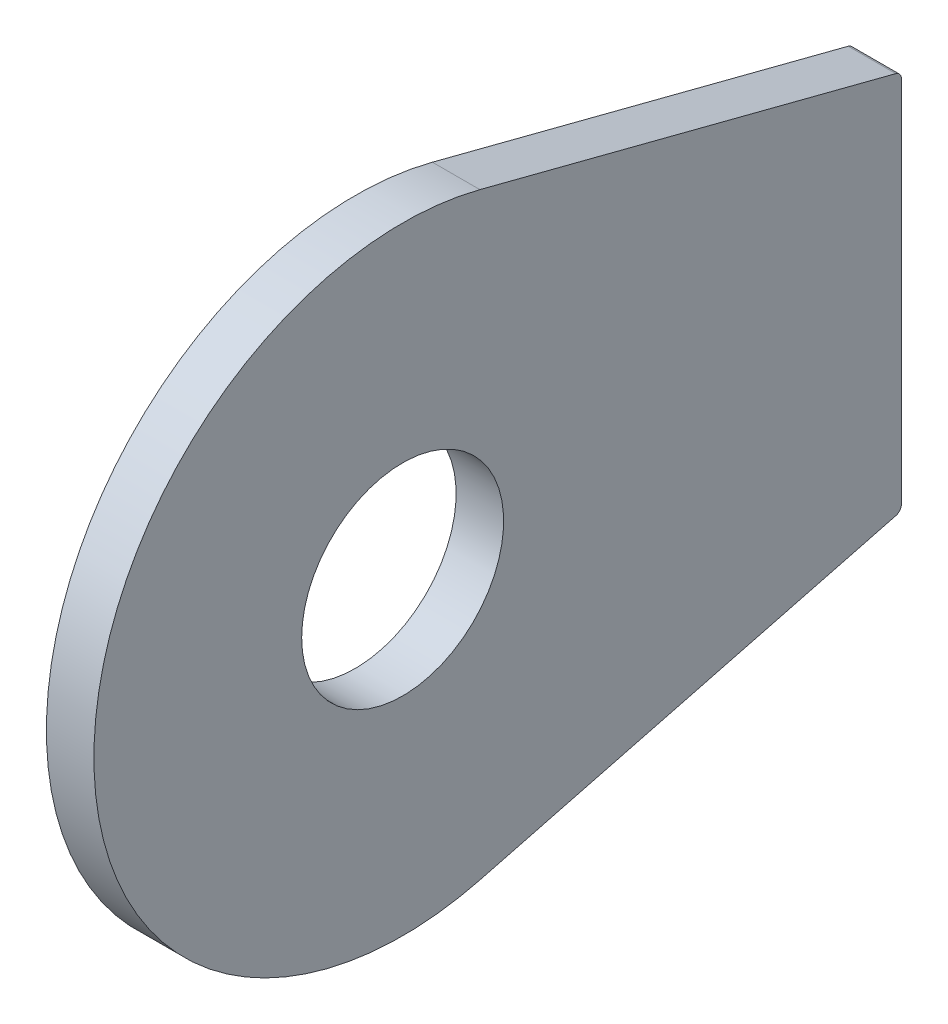
ISO-10303-21;
HEADER;
FILE_DESCRIPTION(('STEP AP214'),'2;1');
FILE_NAME('part.step','',(''),(''),'','','');
FILE_SCHEMA(('AUTOMOTIVE_DESIGN { 1 0 10303 214 1 1 1 1 }'));
ENDSEC;
DATA;
#1=APPLICATION_CONTEXT('core data for automotive mechanical design processes');
#2=APPLICATION_PROTOCOL_DEFINITION('international standard','automotive_design',2000,#1);
#3=PRODUCT_CONTEXT('',#1,'mechanical');
#4=PRODUCT('Part','Part','',(#3));
#5=PRODUCT_RELATED_PRODUCT_CATEGORY('part','',(#4));
#6=PRODUCT_DEFINITION_FORMATION('','',#4);
#7=PRODUCT_DEFINITION_CONTEXT('part definition',#1,'design');
#8=PRODUCT_DEFINITION('design','',#6,#7);
#9=PRODUCT_DEFINITION_SHAPE('','',#8);
#10=(LENGTH_UNIT() NAMED_UNIT(*) SI_UNIT(.MILLI.,.METRE.));
#11=(NAMED_UNIT(*) PLANE_ANGLE_UNIT() SI_UNIT($,.RADIAN.));
#12=(NAMED_UNIT(*) SI_UNIT($,.STERADIAN.) SOLID_ANGLE_UNIT());
#13=UNCERTAINTY_MEASURE_WITH_UNIT(LENGTH_MEASURE(1.E-05),#10,'distance_accuracy_value','');
#14=(GEOMETRIC_REPRESENTATION_CONTEXT(3) GLOBAL_UNCERTAINTY_ASSIGNED_CONTEXT((#13)) GLOBAL_UNIT_ASSIGNED_CONTEXT((#10,
#11,#12)) REPRESENTATION_CONTEXT('',''));
#15=CARTESIAN_POINT('',(0.,0.,0.));
#16=DIRECTION('',(0.,0.,1.));
#17=DIRECTION('',(1.,0.,0.));
#18=AXIS2_PLACEMENT_3D('',#15,#16,#17);
#19=CARTESIAN_POINT('',(1.5875,19.981037813843,-5.1637713090122));
#20=DIRECTION('',(0.,-0.968190808665922,0.250213025270125));
#21=DIRECTION('',(0.,-0.250213025270125,-0.968190808665922));
#22=AXIS2_PLACEMENT_3D('',#19,#20,#21);
#23=PLANE('',#22);
#24=DIRECTION('',(0.,0.250213025270125,0.968190808665922));
#25=VECTOR('',#24,1.);
#26=CARTESIAN_POINT('',(1.5875,19.981037813843,-5.1637713090122));
#27=LINE('',#26,#25);
#28=CARTESIAN_POINT('',(1.5875,12.7984352304449,-32.9566082168372));
#29=VERTEX_POINT('',#28);
#30=CARTESIAN_POINT('',(1.5875,19.981037813843,-5.16377130901221));
#31=VERTEX_POINT('',#30);
#32=EDGE_CURVE('E98',#29,#31,#27,.T.);
#33=ORIENTED_EDGE('',*,*,#32,.F.);
#34=DIRECTION('',(-1.,0.,0.));
#35=VECTOR('',#34,1.);
#36=CARTESIAN_POINT('',(1.5875,12.7984352304449,-32.9566082168372));
#37=LINE('',#36,#35);
#38=CARTESIAN_POINT('',(-1.5875,12.7984352304449,-32.9566082168372));
#39=VERTEX_POINT('',#38);
#40=EDGE_CURVE('E136',#29,#39,#37,.T.);
#41=ORIENTED_EDGE('',*,*,#40,.T.);
#42=DIRECTION('',(0.,0.250213025270125,0.968190808665922));
#43=VECTOR('',#42,1.);
#44=CARTESIAN_POINT('',(-1.5875,19.981037813843,-5.1637713090122));
#45=LINE('',#44,#43);
#46=CARTESIAN_POINT('',(-1.5875,19.981037813843,-5.16377130901221));
#47=VERTEX_POINT('',#46);
#48=EDGE_CURVE('E120',#39,#47,#45,.T.);
#49=ORIENTED_EDGE('',*,*,#48,.T.);
#50=DIRECTION('',(-1.,0.,0.));
#51=VECTOR('',#50,1.);
#52=CARTESIAN_POINT('',(1.5875,19.981037813843,-5.16377130901221));
#53=LINE('',#52,#51);
#54=EDGE_CURVE('E115',#31,#47,#53,.T.);
#55=ORIENTED_EDGE('',*,*,#54,.F.);
#56=EDGE_LOOP('',(#33,#41,#49,#55));
#57=FACE_BOUND('',#56,.T.);
#58=ADVANCED_FACE('F45',(#57),#23,.F.);
#59=CARTESIAN_POINT('',(1.5875,0.,0.));
#60=DIRECTION('',(-1.,0.,0.));
#61=DIRECTION('',(0.,0.,1.));
#62=AXIS2_PLACEMENT_3D('',#59,#60,#61);
#63=CYLINDRICAL_SURFACE('',#62,20.6375);
#64=CARTESIAN_POINT('',(-1.5875,0.,0.));
#65=DIRECTION('',(1.,0.,0.));
#66=DIRECTION('',(0.,0.,-1.));
#67=AXIS2_PLACEMENT_3D('',#64,#65,#66);
#68=CIRCLE('',#67,20.6375);
#69=CARTESIAN_POINT('',(-1.5875,-19.981037813843,-5.16377130901221));
#70=VERTEX_POINT('',#69);
#71=EDGE_CURVE('E140',#47,#70,#68,.T.);
#72=ORIENTED_EDGE('',*,*,#71,.T.);
#73=DIRECTION('',(-1.,0.,0.));
#74=VECTOR('',#73,1.);
#75=CARTESIAN_POINT('',(1.5875,-19.981037813843,-5.16377130901221));
#76=LINE('',#75,#74);
#77=CARTESIAN_POINT('',(1.5875,-19.981037813843,-5.16377130901221));
#78=VERTEX_POINT('',#77);
#79=EDGE_CURVE('E117',#78,#70,#76,.T.);
#80=ORIENTED_EDGE('',*,*,#79,.F.);
#81=CARTESIAN_POINT('',(1.5875,0.,0.));
#82=DIRECTION('',(1.,0.,0.));
#83=DIRECTION('',(0.,0.,-1.));
#84=AXIS2_PLACEMENT_3D('',#81,#82,#83);
#85=CIRCLE('',#84,20.6375);
#86=EDGE_CURVE('E102',#31,#78,#85,.T.);
#87=ORIENTED_EDGE('',*,*,#86,.F.);
#88=ORIENTED_EDGE('',*,*,#54,.T.);
#89=EDGE_LOOP('',(#72,#80,#87,#88));
#90=FACE_BOUND('',#89,.T.);
#91=ADVANCED_FACE('F114',(#90),#63,.T.);
#92=CARTESIAN_POINT('',(1.5875,-19.981037813843,-5.1637713090122));
#93=DIRECTION('',(0.,-0.968190808665922,-0.250213025270125));
#94=DIRECTION('',(0.,0.250213025270125,-0.968190808665922));
#95=AXIS2_PLACEMENT_3D('',#92,#93,#94);
#96=PLANE('',#95);
#97=DIRECTION('',(0.,-0.250213025270125,0.968190808665922));
#98=VECTOR('',#97,1.);
#99=CARTESIAN_POINT('',(-1.5875,-19.981037813843,-5.1637713090122));
#100=LINE('',#99,#98);
#101=CARTESIAN_POINT('',(-1.5875,-12.7984352304449,-32.9566082168372));
#102=VERTEX_POINT('',#101);
#103=EDGE_CURVE('E143',#102,#70,#100,.T.);
#104=ORIENTED_EDGE('',*,*,#103,.F.);
#105=DIRECTION('',(-1.,0.,0.));
#106=VECTOR('',#105,1.);
#107=CARTESIAN_POINT('',(1.5875,-12.7984352304449,-32.9566082168372));
#108=LINE('',#107,#106);
#109=CARTESIAN_POINT('',(1.5875,-12.7984352304449,-32.9566082168372));
#110=VERTEX_POINT('',#109);
#111=EDGE_CURVE('E132',#102,#110,#108,.F.);
#112=ORIENTED_EDGE('',*,*,#111,.T.);
#113=DIRECTION('',(0.,-0.250213025270125,0.968190808665922));
#114=VECTOR('',#113,1.);
#115=CARTESIAN_POINT('',(1.5875,-19.981037813843,-5.1637713090122));
#116=LINE('',#115,#114);
#117=EDGE_CURVE('E118',#110,#78,#116,.T.);
#118=ORIENTED_EDGE('',*,*,#117,.T.);
#119=ORIENTED_EDGE('',*,*,#79,.T.);
#120=EDGE_LOOP('',(#104,#112,#118,#119));
#121=FACE_BOUND('',#120,.T.);
#122=ADVANCED_FACE('F170',(#121),#96,.T.);
#123=CARTESIAN_POINT('',(1.5875,0.,-33.3375));
#124=DIRECTION('',(0.,0.,1.));
#125=DIRECTION('',(1.,0.,0.));
#126=AXIS2_PLACEMENT_3D('',#123,#124,#125);
#127=PLANE('',#126);
#128=DIRECTION('',(0.,1.,0.));
#129=VECTOR('',#128,1.);
#130=CARTESIAN_POINT('',(-1.5875,0.,-33.3375));
#131=LINE('',#130,#129);
#132=CARTESIAN_POINT('',(-1.5875,-12.3065942996426,-33.3375));
#133=VERTEX_POINT('',#132);
#134=CARTESIAN_POINT('',(-1.5875,12.3065942996426,-33.3375));
#135=VERTEX_POINT('',#134);
#136=EDGE_CURVE('E109',#133,#135,#131,.T.);
#137=ORIENTED_EDGE('',*,*,#136,.T.);
#138=DIRECTION('',(-1.,0.,0.));
#139=VECTOR('',#138,1.);
#140=CARTESIAN_POINT('',(1.5875,12.3065942996426,-33.3375));
#141=LINE('',#140,#139);
#142=CARTESIAN_POINT('',(1.5875,12.3065942996426,-33.3375));
#143=VERTEX_POINT('',#142);
#144=EDGE_CURVE('E53',#135,#143,#141,.F.);
#145=ORIENTED_EDGE('',*,*,#144,.T.);
#146=DIRECTION('',(0.,1.,0.));
#147=VECTOR('',#146,1.);
#148=CARTESIAN_POINT('',(1.5875,0.,-33.3375));
#149=LINE('',#148,#147);
#150=CARTESIAN_POINT('',(1.5875,-12.3065942996426,-33.3375));
#151=VERTEX_POINT('',#150);
#152=EDGE_CURVE('E127',#151,#143,#149,.T.);
#153=ORIENTED_EDGE('',*,*,#152,.F.);
#154=DIRECTION('',(-1.,0.,0.));
#155=VECTOR('',#154,1.);
#156=CARTESIAN_POINT('',(-1.5875,-12.3065942996426,-33.3375));
#157=LINE('',#156,#155);
#158=EDGE_CURVE('E122',#151,#133,#157,.T.);
#159=ORIENTED_EDGE('',*,*,#158,.T.);
#160=EDGE_LOOP('',(#137,#145,#153,#159));
#161=FACE_BOUND('',#160,.T.);
#162=ADVANCED_FACE('F151',(#161),#127,.F.);
#163=CARTESIAN_POINT('',(1.5875,0.,0.));
#164=DIRECTION('',(1.,0.,0.));
#165=DIRECTION('',(0.,0.,-1.));
#166=AXIS2_PLACEMENT_3D('',#163,#164,#165);
#167=PLANE('',#166);
#168=CARTESIAN_POINT('',(1.5875,0.,0.));
#169=DIRECTION('',(-1.,0.,0.));
#170=DIRECTION('',(0.,0.,1.));
#171=AXIS2_PLACEMENT_3D('',#168,#169,#170);
#172=CIRCLE('',#171,6.75);
#173=CARTESIAN_POINT('',(1.5875,0.,6.75));
#174=VERTEX_POINT('',#173);
#175=EDGE_CURVE('E141',#174,#174,#172,.T.);
#176=ORIENTED_EDGE('',*,*,#175,.T.);
#177=EDGE_LOOP('',(#176));
#178=FACE_BOUND('',#177,.T.);
#179=ORIENTED_EDGE('',*,*,#152,.T.);
#180=CARTESIAN_POINT('',(1.5875,12.3065942996426,-32.8295));
#181=DIRECTION('',(1.,0.,0.));
#182=DIRECTION('',(0.,0.,-1.));
#183=AXIS2_PLACEMENT_3D('',#180,#181,#182);
#184=CIRCLE('',#183,0.508);
#185=EDGE_CURVE('E11',#143,#29,#184,.T.);
#186=ORIENTED_EDGE('',*,*,#185,.T.);
#187=ORIENTED_EDGE('',*,*,#32,.T.);
#188=ORIENTED_EDGE('',*,*,#86,.T.);
#189=ORIENTED_EDGE('',*,*,#117,.F.);
#190=CARTESIAN_POINT('',(1.5875,-12.3065942996426,-32.8295));
#191=DIRECTION('',(1.,0.,0.));
#192=DIRECTION('',(0.,0.,-1.));
#193=AXIS2_PLACEMENT_3D('',#190,#191,#192);
#194=CIRCLE('',#193,0.508);
#195=EDGE_CURVE('E134',#110,#151,#194,.T.);
#196=ORIENTED_EDGE('',*,*,#195,.T.);
#197=EDGE_LOOP('',(#179,#186,#187,#188,#189,#196));
#198=FACE_BOUND('',#197,.T.);
#199=ADVANCED_FACE('F100',(#178,#198),#167,.T.);
#200=CARTESIAN_POINT('',(-1.5875,0.,0.));
#201=DIRECTION('',(1.,0.,0.));
#202=DIRECTION('',(0.,0.,-1.));
#203=AXIS2_PLACEMENT_3D('',#200,#201,#202);
#204=PLANE('',#203);
#205=CARTESIAN_POINT('',(-1.5875,0.,0.));
#206=DIRECTION('',(-1.,0.,0.));
#207=DIRECTION('',(0.,0.,1.));
#208=AXIS2_PLACEMENT_3D('',#205,#206,#207);
#209=CIRCLE('',#208,6.75);
#210=CARTESIAN_POINT('',(-1.5875,0.,6.75));
#211=VERTEX_POINT('',#210);
#212=EDGE_CURVE('E146',#211,#211,#209,.T.);
#213=ORIENTED_EDGE('',*,*,#212,.F.);
#214=EDGE_LOOP('',(#213));
#215=FACE_BOUND('',#214,.T.);
#216=ORIENTED_EDGE('',*,*,#48,.F.);
#217=CARTESIAN_POINT('',(-1.5875,12.3065942996426,-32.8295));
#218=DIRECTION('',(1.,0.,0.));
#219=DIRECTION('',(0.,0.,-1.));
#220=AXIS2_PLACEMENT_3D('',#217,#218,#219);
#221=CIRCLE('',#220,0.508);
#222=EDGE_CURVE('E67',#39,#135,#221,.F.);
#223=ORIENTED_EDGE('',*,*,#222,.T.);
#224=ORIENTED_EDGE('',*,*,#136,.F.);
#225=CARTESIAN_POINT('',(-1.5875,-12.3065942996426,-32.8295));
#226=DIRECTION('',(1.,0.,0.));
#227=DIRECTION('',(0.,0.,-1.));
#228=AXIS2_PLACEMENT_3D('',#225,#226,#227);
#229=CIRCLE('',#228,0.508);
#230=EDGE_CURVE('E125',#133,#102,#229,.F.);
#231=ORIENTED_EDGE('',*,*,#230,.T.);
#232=ORIENTED_EDGE('',*,*,#103,.T.);
#233=ORIENTED_EDGE('',*,*,#71,.F.);
#234=EDGE_LOOP('',(#216,#223,#224,#231,#232,#233));
#235=FACE_BOUND('',#234,.T.);
#236=ADVANCED_FACE('F139',(#215,#235),#204,.F.);
#237=CARTESIAN_POINT('',(1.5875,-12.3065942996426,-32.8295));
#238=DIRECTION('',(1.,0.,0.));
#239=DIRECTION('',(0.,0.,-1.));
#240=AXIS2_PLACEMENT_3D('',#237,#238,#239);
#241=CYLINDRICAL_SURFACE('',#240,0.508);
#242=ORIENTED_EDGE('',*,*,#195,.F.);
#243=ORIENTED_EDGE('',*,*,#111,.F.);
#244=ORIENTED_EDGE('',*,*,#230,.F.);
#245=ORIENTED_EDGE('',*,*,#158,.F.);
#246=EDGE_LOOP('',(#242,#243,#244,#245));
#247=FACE_BOUND('',#246,.T.);
#248=ADVANCED_FACE('F155',(#247),#241,.T.);
#249=CARTESIAN_POINT('',(1.5875,12.3065942996426,-32.8295));
#250=DIRECTION('',(-1.,0.,0.));
#251=DIRECTION('',(0.,0.,1.));
#252=AXIS2_PLACEMENT_3D('',#249,#250,#251);
#253=CYLINDRICAL_SURFACE('',#252,0.508);
#254=ORIENTED_EDGE('',*,*,#185,.F.);
#255=ORIENTED_EDGE('',*,*,#144,.F.);
#256=ORIENTED_EDGE('',*,*,#222,.F.);
#257=ORIENTED_EDGE('',*,*,#40,.F.);
#258=EDGE_LOOP('',(#254,#255,#256,#257));
#259=FACE_BOUND('',#258,.T.);
#260=ADVANCED_FACE('F47',(#259),#253,.T.);
#261=CARTESIAN_POINT('',(-1.5875,0.,0.));
#262=DIRECTION('',(-1.,0.,0.));
#263=DIRECTION('',(0.,0.,1.));
#264=AXIS2_PLACEMENT_3D('',#261,#262,#263);
#265=CYLINDRICAL_SURFACE('',#264,6.75);
#266=ORIENTED_EDGE('',*,*,#175,.F.);
#267=EDGE_LOOP('',(#266));
#268=FACE_BOUND('',#267,.T.);
#269=ORIENTED_EDGE('',*,*,#212,.T.);
#270=EDGE_LOOP('',(#269));
#271=FACE_BOUND('',#270,.T.);
#272=ADVANCED_FACE('F154',(#268,#271),#265,.F.);
#273=CLOSED_SHELL('',(#58,#91,#122,#162,#199,#236,#248,#260,#272));
#274=MANIFOLD_SOLID_BREP('B2',#273);
#275=ADVANCED_BREP_SHAPE_REPRESENTATION('',(#18,#274),#14);
#276=SHAPE_DEFINITION_REPRESENTATION(#9,#275);
ENDSEC;
END-ISO-10303-21;
